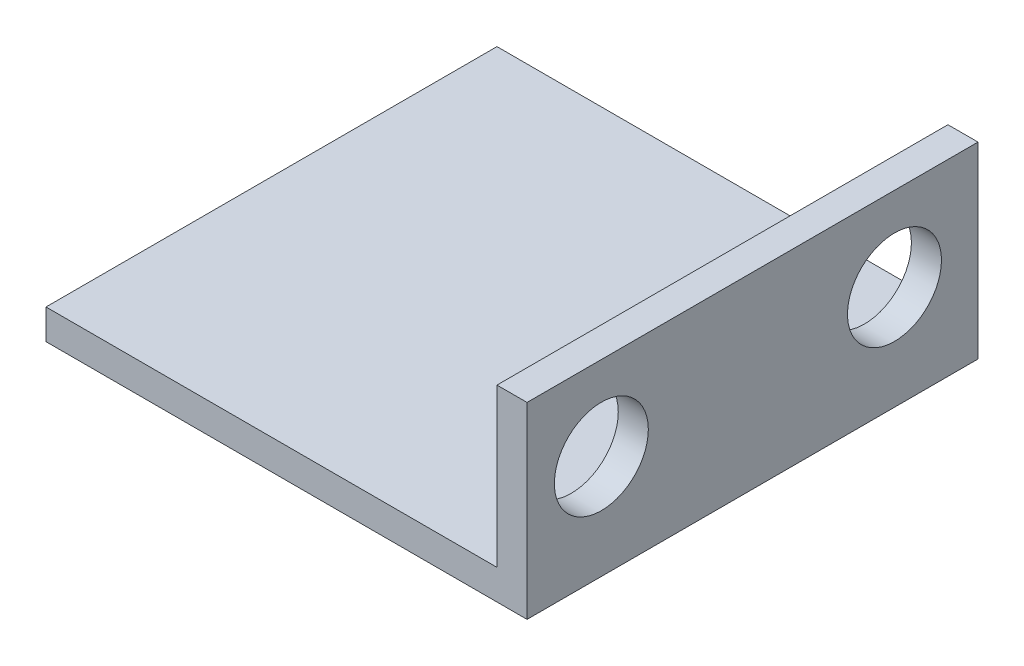
ISO-10303-21;
HEADER;
FILE_DESCRIPTION(('STEP AP214'),'2;1');
FILE_NAME('part.step','',(''),(''),'','','');
FILE_SCHEMA(('AUTOMOTIVE_DESIGN { 1 0 10303 214 1 1 1 1 }'));
ENDSEC;
DATA;
#1=APPLICATION_CONTEXT('core data for automotive mechanical design processes');
#2=APPLICATION_PROTOCOL_DEFINITION('international standard','automotive_design',2000,#1);
#3=PRODUCT_CONTEXT('',#1,'mechanical');
#4=PRODUCT('Part','Part','',(#3));
#5=PRODUCT_RELATED_PRODUCT_CATEGORY('part','',(#4));
#6=PRODUCT_DEFINITION_FORMATION('','',#4);
#7=PRODUCT_DEFINITION_CONTEXT('part definition',#1,'design');
#8=PRODUCT_DEFINITION('design','',#6,#7);
#9=PRODUCT_DEFINITION_SHAPE('','',#8);
#10=(LENGTH_UNIT() NAMED_UNIT(*) SI_UNIT(.MILLI.,.METRE.));
#11=(NAMED_UNIT(*) PLANE_ANGLE_UNIT() SI_UNIT($,.RADIAN.));
#12=(NAMED_UNIT(*) SI_UNIT($,.STERADIAN.) SOLID_ANGLE_UNIT());
#13=UNCERTAINTY_MEASURE_WITH_UNIT(LENGTH_MEASURE(1.E-05),#10,'distance_accuracy_value','');
#14=(GEOMETRIC_REPRESENTATION_CONTEXT(3) GLOBAL_UNCERTAINTY_ASSIGNED_CONTEXT((#13)) GLOBAL_UNIT_ASSIGNED_CONTEXT((#10,
#11,#12)) REPRESENTATION_CONTEXT('',''));
#15=CARTESIAN_POINT('',(0.,0.,0.));
#16=DIRECTION('',(0.,0.,1.));
#17=DIRECTION('',(1.,0.,0.));
#18=AXIS2_PLACEMENT_3D('',#15,#16,#17);
#19=CARTESIAN_POINT('',(-60.,8.,-60.));
#20=DIRECTION('',(0.,0.,1.));
#21=DIRECTION('',(1.,0.,0.));
#22=AXIS2_PLACEMENT_3D('',#19,#20,#21);
#23=PLANE('',#22);
#24=DIRECTION('',(-1.,0.,0.));
#25=VECTOR('',#24,1.);
#26=CARTESIAN_POINT('',(-60.,0.,-60.));
#27=LINE('',#26,#25);
#28=CARTESIAN_POINT('',(68.,0.,-60.));
#29=VERTEX_POINT('',#28);
#30=CARTESIAN_POINT('',(-60.,0.,-60.));
#31=VERTEX_POINT('',#30);
#32=EDGE_CURVE('E66',#29,#31,#27,.T.);
#33=ORIENTED_EDGE('',*,*,#32,.T.);
#34=DIRECTION('',(0.,-1.,0.));
#35=VECTOR('',#34,1.);
#36=CARTESIAN_POINT('',(-60.,8.,-60.));
#37=LINE('',#36,#35);
#38=CARTESIAN_POINT('',(-60.,8.,-60.));
#39=VERTEX_POINT('',#38);
#40=EDGE_CURVE('E11',#39,#31,#37,.T.);
#41=ORIENTED_EDGE('',*,*,#40,.F.);
#42=DIRECTION('',(-1.,0.,0.));
#43=VECTOR('',#42,1.);
#44=CARTESIAN_POINT('',(-60.,8.,-60.));
#45=LINE('',#44,#43);
#46=CARTESIAN_POINT('',(60.,8.,-60.));
#47=VERTEX_POINT('',#46);
#48=EDGE_CURVE('E94',#47,#39,#45,.T.);
#49=ORIENTED_EDGE('',*,*,#48,.F.);
#50=DIRECTION('',(0.,1.,0.));
#51=VECTOR('',#50,1.);
#52=CARTESIAN_POINT('',(60.,50.,-60.));
#53=LINE('',#52,#51);
#54=CARTESIAN_POINT('',(60.,50.,-60.));
#55=VERTEX_POINT('',#54);
#56=EDGE_CURVE('E84',#47,#55,#53,.T.);
#57=ORIENTED_EDGE('',*,*,#56,.T.);
#58=DIRECTION('',(-1.,0.,0.));
#59=VECTOR('',#58,1.);
#60=CARTESIAN_POINT('',(68.,50.,-60.));
#61=LINE('',#60,#59);
#62=CARTESIAN_POINT('',(68.,50.,-60.));
#63=VERTEX_POINT('',#62);
#64=EDGE_CURVE('E105',#63,#55,#61,.T.);
#65=ORIENTED_EDGE('',*,*,#64,.F.);
#66=DIRECTION('',(0.,1.,0.));
#67=VECTOR('',#66,1.);
#68=CARTESIAN_POINT('',(68.,50.,-60.));
#69=LINE('',#68,#67);
#70=EDGE_CURVE('E138',#29,#63,#69,.T.);
#71=ORIENTED_EDGE('',*,*,#70,.F.);
#72=EDGE_LOOP('',(#33,#41,#49,#57,#65,#71));
#73=FACE_BOUND('',#72,.T.);
#74=ADVANCED_FACE('F38',(#73),#23,.F.);
#75=CARTESIAN_POINT('',(-60.,8.,-60.));
#76=DIRECTION('',(1.,0.,0.));
#77=DIRECTION('',(0.,0.,-1.));
#78=AXIS2_PLACEMENT_3D('',#75,#76,#77);
#79=PLANE('',#78);
#80=DIRECTION('',(0.,0.,1.));
#81=VECTOR('',#80,1.);
#82=CARTESIAN_POINT('',(-60.,0.,-60.));
#83=LINE('',#82,#81);
#84=CARTESIAN_POINT('',(-60.,0.,60.));
#85=VERTEX_POINT('',#84);
#86=EDGE_CURVE('E102',#31,#85,#83,.T.);
#87=ORIENTED_EDGE('',*,*,#86,.T.);
#88=DIRECTION('',(0.,-1.,0.));
#89=VECTOR('',#88,1.);
#90=CARTESIAN_POINT('',(-60.,8.,60.));
#91=LINE('',#90,#89);
#92=CARTESIAN_POINT('',(-60.,8.,60.));
#93=VERTEX_POINT('',#92);
#94=EDGE_CURVE('E46',#93,#85,#91,.T.);
#95=ORIENTED_EDGE('',*,*,#94,.F.);
#96=DIRECTION('',(0.,0.,1.));
#97=VECTOR('',#96,1.);
#98=CARTESIAN_POINT('',(-60.,8.,-60.));
#99=LINE('',#98,#97);
#100=EDGE_CURVE('E54',#39,#93,#99,.T.);
#101=ORIENTED_EDGE('',*,*,#100,.F.);
#102=ORIENTED_EDGE('',*,*,#40,.T.);
#103=EDGE_LOOP('',(#87,#95,#101,#102));
#104=FACE_BOUND('',#103,.T.);
#105=ADVANCED_FACE('F185',(#104),#79,.F.);
#106=CARTESIAN_POINT('',(-60.,8.,60.));
#107=DIRECTION('',(0.,0.,-1.));
#108=DIRECTION('',(-1.,0.,0.));
#109=AXIS2_PLACEMENT_3D('',#106,#107,#108);
#110=PLANE('',#109);
#111=DIRECTION('',(1.,0.,0.));
#112=VECTOR('',#111,1.);
#113=CARTESIAN_POINT('',(-60.,0.,60.));
#114=LINE('',#113,#112);
#115=CARTESIAN_POINT('',(68.,0.,60.));
#116=VERTEX_POINT('',#115);
#117=EDGE_CURVE('E99',#85,#116,#114,.T.);
#118=ORIENTED_EDGE('',*,*,#117,.T.);
#119=DIRECTION('',(0.,-1.,0.));
#120=VECTOR('',#119,1.);
#121=CARTESIAN_POINT('',(68.,50.,60.));
#122=LINE('',#121,#120);
#123=CARTESIAN_POINT('',(68.,50.,60.));
#124=VERTEX_POINT('',#123);
#125=EDGE_CURVE('E129',#124,#116,#122,.T.);
#126=ORIENTED_EDGE('',*,*,#125,.F.);
#127=DIRECTION('',(-1.,0.,0.));
#128=VECTOR('',#127,1.);
#129=CARTESIAN_POINT('',(68.,50.,60.));
#130=LINE('',#129,#128);
#131=CARTESIAN_POINT('',(60.,50.,60.));
#132=VERTEX_POINT('',#131);
#133=EDGE_CURVE('E128',#124,#132,#130,.T.);
#134=ORIENTED_EDGE('',*,*,#133,.T.);
#135=DIRECTION('',(0.,-1.,0.));
#136=VECTOR('',#135,1.);
#137=CARTESIAN_POINT('',(60.,50.,60.));
#138=LINE('',#137,#136);
#139=CARTESIAN_POINT('',(60.,8.,60.));
#140=VERTEX_POINT('',#139);
#141=EDGE_CURVE('E137',#132,#140,#138,.T.);
#142=ORIENTED_EDGE('',*,*,#141,.T.);
#143=DIRECTION('',(1.,0.,0.));
#144=VECTOR('',#143,1.);
#145=CARTESIAN_POINT('',(-60.,8.,60.));
#146=LINE('',#145,#144);
#147=EDGE_CURVE('E98',#93,#140,#146,.T.);
#148=ORIENTED_EDGE('',*,*,#147,.F.);
#149=ORIENTED_EDGE('',*,*,#94,.T.);
#150=EDGE_LOOP('',(#118,#126,#134,#142,#148,#149));
#151=FACE_BOUND('',#150,.T.);
#152=ADVANCED_FACE('F114',(#151),#110,.F.);
#153=CARTESIAN_POINT('',(0.,8.,0.));
#154=DIRECTION('',(0.,1.,0.));
#155=DIRECTION('',(0.,0.,1.));
#156=AXIS2_PLACEMENT_3D('',#153,#154,#155);
#157=PLANE('',#156);
#158=DIRECTION('',(0.,0.,-1.));
#159=VECTOR('',#158,1.);
#160=CARTESIAN_POINT('',(60.,8.,-60.));
#161=LINE('',#160,#159);
#162=EDGE_CURVE('E75',#140,#47,#161,.T.);
#163=ORIENTED_EDGE('',*,*,#162,.T.);
#164=ORIENTED_EDGE('',*,*,#48,.T.);
#165=ORIENTED_EDGE('',*,*,#100,.T.);
#166=ORIENTED_EDGE('',*,*,#147,.T.);
#167=EDGE_LOOP('',(#163,#164,#165,#166));
#168=FACE_BOUND('',#167,.T.);
#169=ADVANCED_FACE('F96',(#168),#157,.T.);
#170=CARTESIAN_POINT('',(0.,0.,0.));
#171=DIRECTION('',(0.,1.,0.));
#172=DIRECTION('',(0.,0.,1.));
#173=AXIS2_PLACEMENT_3D('',#170,#171,#172);
#174=PLANE('',#173);
#175=CARTESIAN_POINT('',(0.,0.,0.));
#176=DIRECTION('',(0.,-1.,0.));
#177=DIRECTION('',(0.,0.,-1.));
#178=AXIS2_PLACEMENT_3D('',#175,#176,#177);
#179=CIRCLE('',#178,55.);
#180=CARTESIAN_POINT('',(0.,0.,-55.));
#181=VERTEX_POINT('',#180);
#182=EDGE_CURVE('E155',#181,#181,#179,.T.);
#183=ORIENTED_EDGE('',*,*,#182,.F.);
#184=EDGE_LOOP('',(#183));
#185=FACE_BOUND('',#184,.T.);
#186=ORIENTED_EDGE('',*,*,#32,.F.);
#187=DIRECTION('',(0.,0.,-1.));
#188=VECTOR('',#187,1.);
#189=CARTESIAN_POINT('',(68.,0.,60.));
#190=LINE('',#189,#188);
#191=EDGE_CURVE('E123',#116,#29,#190,.T.);
#192=ORIENTED_EDGE('',*,*,#191,.F.);
#193=ORIENTED_EDGE('',*,*,#117,.F.);
#194=ORIENTED_EDGE('',*,*,#86,.F.);
#195=EDGE_LOOP('',(#186,#192,#193,#194));
#196=FACE_BOUND('',#195,.T.);
#197=ADVANCED_FACE('F121',(#185,#196),#174,.F.);
#198=CARTESIAN_POINT('',(68.,50.,60.));
#199=DIRECTION('',(0.,-1.,0.));
#200=DIRECTION('',(0.,0.,-1.));
#201=AXIS2_PLACEMENT_3D('',#198,#199,#200);
#202=PLANE('',#201);
#203=DIRECTION('',(0.,0.,1.));
#204=VECTOR('',#203,1.);
#205=CARTESIAN_POINT('',(60.,50.,60.));
#206=LINE('',#205,#204);
#207=EDGE_CURVE('E89',#55,#132,#206,.T.);
#208=ORIENTED_EDGE('',*,*,#207,.T.);
#209=ORIENTED_EDGE('',*,*,#133,.F.);
#210=DIRECTION('',(0.,0.,1.));
#211=VECTOR('',#210,1.);
#212=CARTESIAN_POINT('',(68.,50.,60.));
#213=LINE('',#212,#211);
#214=EDGE_CURVE('E132',#63,#124,#213,.T.);
#215=ORIENTED_EDGE('',*,*,#214,.F.);
#216=ORIENTED_EDGE('',*,*,#64,.T.);
#217=EDGE_LOOP('',(#208,#209,#215,#216));
#218=FACE_BOUND('',#217,.T.);
#219=ADVANCED_FACE('F171',(#218),#202,.F.);
#220=CARTESIAN_POINT('',(68.,0.,0.));
#221=DIRECTION('',(1.,0.,0.));
#222=DIRECTION('',(0.,0.,-1.));
#223=AXIS2_PLACEMENT_3D('',#220,#221,#222);
#224=PLANE('',#223);
#225=CARTESIAN_POINT('',(68.,27.667787736038,40.2219254544023));
#226=DIRECTION('',(1.,0.,0.));
#227=DIRECTION('',(0.,0.,-1.));
#228=AXIS2_PLACEMENT_3D('',#225,#226,#227);
#229=CIRCLE('',#228,12.5);
#230=CARTESIAN_POINT('',(68.,27.667787736038,27.7219254544023));
#231=VERTEX_POINT('',#230);
#232=EDGE_CURVE('E150',#231,#231,#229,.T.);
#233=ORIENTED_EDGE('',*,*,#232,.F.);
#234=EDGE_LOOP('',(#233));
#235=FACE_BOUND('',#234,.T.);
#236=CARTESIAN_POINT('',(68.,27.6658108344845,-37.7780745205455));
#237=DIRECTION('',(1.,0.,0.));
#238=DIRECTION('',(0.,0.,-1.));
#239=AXIS2_PLACEMENT_3D('',#236,#237,#238);
#240=CIRCLE('',#239,12.5);
#241=CARTESIAN_POINT('',(68.,27.6658108344845,-50.2780745205455));
#242=VERTEX_POINT('',#241);
#243=EDGE_CURVE('E146',#242,#242,#240,.T.);
#244=ORIENTED_EDGE('',*,*,#243,.F.);
#245=EDGE_LOOP('',(#244));
#246=FACE_BOUND('',#245,.T.);
#247=ORIENTED_EDGE('',*,*,#70,.T.);
#248=ORIENTED_EDGE('',*,*,#214,.T.);
#249=ORIENTED_EDGE('',*,*,#125,.T.);
#250=ORIENTED_EDGE('',*,*,#191,.T.);
#251=EDGE_LOOP('',(#247,#248,#249,#250));
#252=FACE_BOUND('',#251,.T.);
#253=ADVANCED_FACE('F178',(#235,#246,#252),#224,.T.);
#254=CARTESIAN_POINT('',(60.,0.,0.));
#255=DIRECTION('',(1.,0.,0.));
#256=DIRECTION('',(0.,0.,-1.));
#257=AXIS2_PLACEMENT_3D('',#254,#255,#256);
#258=PLANE('',#257);
#259=CARTESIAN_POINT('',(60.,27.667787736038,40.2219254544023));
#260=DIRECTION('',(1.,0.,0.));
#261=DIRECTION('',(0.,0.,-1.));
#262=AXIS2_PLACEMENT_3D('',#259,#260,#261);
#263=CIRCLE('',#262,12.5);
#264=CARTESIAN_POINT('',(60.,27.667787736038,27.7219254544023));
#265=VERTEX_POINT('',#264);
#266=EDGE_CURVE('E92',#265,#265,#263,.T.);
#267=ORIENTED_EDGE('',*,*,#266,.T.);
#268=EDGE_LOOP('',(#267));
#269=FACE_BOUND('',#268,.T.);
#270=CARTESIAN_POINT('',(60.,27.6658108344845,-37.7780745205455));
#271=DIRECTION('',(1.,0.,0.));
#272=DIRECTION('',(0.,0.,-1.));
#273=AXIS2_PLACEMENT_3D('',#270,#271,#272);
#274=CIRCLE('',#273,12.5);
#275=CARTESIAN_POINT('',(60.,27.6658108344845,-50.2780745205455));
#276=VERTEX_POINT('',#275);
#277=EDGE_CURVE('E143',#276,#276,#274,.T.);
#278=ORIENTED_EDGE('',*,*,#277,.T.);
#279=EDGE_LOOP('',(#278));
#280=FACE_BOUND('',#279,.T.);
#281=ORIENTED_EDGE('',*,*,#162,.F.);
#282=ORIENTED_EDGE('',*,*,#141,.F.);
#283=ORIENTED_EDGE('',*,*,#207,.F.);
#284=ORIENTED_EDGE('',*,*,#56,.F.);
#285=EDGE_LOOP('',(#281,#282,#283,#284));
#286=FACE_BOUND('',#285,.T.);
#287=ADVANCED_FACE('F86',(#269,#280,#286),#258,.F.);
#288=CARTESIAN_POINT('',(60.,27.6658108344845,-37.7780745205455));
#289=DIRECTION('',(1.,0.,0.));
#290=DIRECTION('',(0.,0.,-1.));
#291=AXIS2_PLACEMENT_3D('',#288,#289,#290);
#292=CYLINDRICAL_SURFACE('',#291,12.5);
#293=ORIENTED_EDGE('',*,*,#277,.F.);
#294=EDGE_LOOP('',(#293));
#295=FACE_BOUND('',#294,.T.);
#296=ORIENTED_EDGE('',*,*,#243,.T.);
#297=EDGE_LOOP('',(#296));
#298=FACE_BOUND('',#297,.T.);
#299=ADVANCED_FACE('F220',(#295,#298),#292,.F.);
#300=CARTESIAN_POINT('',(60.,27.667787736038,40.2219254544023));
#301=DIRECTION('',(1.,0.,0.));
#302=DIRECTION('',(0.,0.,-1.));
#303=AXIS2_PLACEMENT_3D('',#300,#301,#302);
#304=CYLINDRICAL_SURFACE('',#303,12.5);
#305=ORIENTED_EDGE('',*,*,#266,.F.);
#306=EDGE_LOOP('',(#305));
#307=FACE_BOUND('',#306,.T.);
#308=ORIENTED_EDGE('',*,*,#232,.T.);
#309=EDGE_LOOP('',(#308));
#310=FACE_BOUND('',#309,.T.);
#311=ADVANCED_FACE('F166',(#307,#310),#304,.F.);
#312=CARTESIAN_POINT('',(0.,0.1,0.));
#313=DIRECTION('',(0.,-1.,0.));
#314=DIRECTION('',(0.,0.,-1.));
#315=AXIS2_PLACEMENT_3D('',#312,#313,#314);
#316=CYLINDRICAL_SURFACE('',#315,55.);
#317=CARTESIAN_POINT('',(0.,0.1,0.));
#318=DIRECTION('',(0.,-1.,0.));
#319=DIRECTION('',(0.,0.,-1.));
#320=AXIS2_PLACEMENT_3D('',#317,#318,#319);
#321=CIRCLE('',#320,55.);
#322=CARTESIAN_POINT('',(0.,0.1,-55.));
#323=VERTEX_POINT('',#322);
#324=EDGE_CURVE('E147',#323,#323,#321,.T.);
#325=ORIENTED_EDGE('',*,*,#324,.F.);
#326=EDGE_LOOP('',(#325));
#327=FACE_BOUND('',#326,.T.);
#328=ORIENTED_EDGE('',*,*,#182,.T.);
#329=EDGE_LOOP('',(#328));
#330=FACE_BOUND('',#329,.T.);
#331=ADVANCED_FACE('F163',(#327,#330),#316,.F.);
#332=CARTESIAN_POINT('',(0.,0.1,0.));
#333=DIRECTION('',(0.,-1.,0.));
#334=DIRECTION('',(0.,0.,-1.));
#335=AXIS2_PLACEMENT_3D('',#332,#333,#334);
#336=PLANE('',#335);
#337=ORIENTED_EDGE('',*,*,#324,.T.);
#338=EDGE_LOOP('',(#337));
#339=FACE_BOUND('',#338,.T.);
#340=ADVANCED_FACE('F161',(#339),#336,.T.);
#341=CLOSED_SHELL('',(#74,#105,#152,#169,#197,#219,#253,#287,#299,#311,#331,#340));
#342=MANIFOLD_SOLID_BREP('B2',#341);
#343=ADVANCED_BREP_SHAPE_REPRESENTATION('',(#18,#342),#14);
#344=SHAPE_DEFINITION_REPRESENTATION(#9,#343);
ENDSEC;
END-ISO-10303-21;
